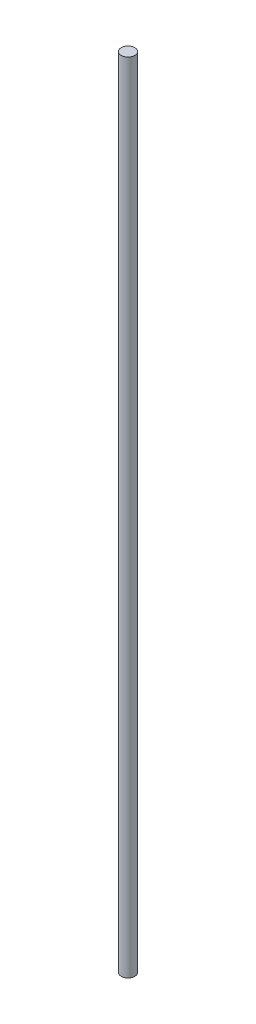
ISO-10303-21;
HEADER;
FILE_DESCRIPTION(('STEP AP214'),'2;1');
FILE_NAME('part.step','',(''),(''),'','','');
FILE_SCHEMA(('AUTOMOTIVE_DESIGN { 1 0 10303 214 1 1 1 1 }'));
ENDSEC;
DATA;
#1=APPLICATION_CONTEXT('core data for automotive mechanical design processes');
#2=APPLICATION_PROTOCOL_DEFINITION('international standard','automotive_design',2000,#1);
#3=PRODUCT_CONTEXT('',#1,'mechanical');
#4=PRODUCT('Part','Part','',(#3));
#5=PRODUCT_RELATED_PRODUCT_CATEGORY('part','',(#4));
#6=PRODUCT_DEFINITION_FORMATION('','',#4);
#7=PRODUCT_DEFINITION_CONTEXT('part definition',#1,'design');
#8=PRODUCT_DEFINITION('design','',#6,#7);
#9=PRODUCT_DEFINITION_SHAPE('','',#8);
#10=(LENGTH_UNIT() NAMED_UNIT(*) SI_UNIT(.MILLI.,.METRE.));
#11=(NAMED_UNIT(*) PLANE_ANGLE_UNIT() SI_UNIT($,.RADIAN.));
#12=(NAMED_UNIT(*) SI_UNIT($,.STERADIAN.) SOLID_ANGLE_UNIT());
#13=UNCERTAINTY_MEASURE_WITH_UNIT(LENGTH_MEASURE(1.E-05),#10,'distance_accuracy_value','');
#14=(GEOMETRIC_REPRESENTATION_CONTEXT(3) GLOBAL_UNCERTAINTY_ASSIGNED_CONTEXT((#13)) GLOBAL_UNIT_ASSIGNED_CONTEXT((#10,
#11,#12)) REPRESENTATION_CONTEXT('',''));
#15=CARTESIAN_POINT('',(0.,0.,0.));
#16=DIRECTION('',(0.,0.,1.));
#17=DIRECTION('',(1.,0.,0.));
#18=AXIS2_PLACEMENT_3D('',#15,#16,#17);
#19=CARTESIAN_POINT('',(-2.49999999999999,147.,0.));
#20=DIRECTION('',(0.,1.,0.));
#21=DIRECTION('',(0.,0.,1.));
#22=AXIS2_PLACEMENT_3D('',#19,#20,#21);
#23=CYLINDRICAL_SURFACE('',#22,2.5);
#24=CARTESIAN_POINT('',(-2.49999999999999,147.,0.));
#25=DIRECTION('',(0.,1.,0.));
#26=DIRECTION('',(0.,0.,1.));
#27=AXIS2_PLACEMENT_3D('',#24,#25,#26);
#28=CIRCLE('',#27,2.5);
#29=CARTESIAN_POINT('',(-2.49999999999999,147.,2.5));
#30=VERTEX_POINT('',#29);
#31=EDGE_CURVE('E10',#30,#30,#28,.T.);
#32=ORIENTED_EDGE('',*,*,#31,.F.);
#33=EDGE_LOOP('',(#32));
#34=FACE_BOUND('',#33,.T.);
#35=CARTESIAN_POINT('',(-2.49999999999999,-147.,0.));
#36=DIRECTION('',(0.,1.,0.));
#37=DIRECTION('',(0.,0.,1.));
#38=AXIS2_PLACEMENT_3D('',#35,#36,#37);
#39=CIRCLE('',#38,2.5);
#40=CARTESIAN_POINT('',(-2.49999999999999,-147.,2.5));
#41=VERTEX_POINT('',#40);
#42=EDGE_CURVE('E43',#41,#41,#39,.T.);
#43=ORIENTED_EDGE('',*,*,#42,.T.);
#44=EDGE_LOOP('',(#43));
#45=FACE_BOUND('',#44,.T.);
#46=ADVANCED_FACE('F37',(#34,#45),#23,.T.);
#47=CARTESIAN_POINT('',(-2.49999999999999,147.,0.));
#48=DIRECTION('',(0.,-1.,0.));
#49=DIRECTION('',(0.,0.,-1.));
#50=AXIS2_PLACEMENT_3D('',#47,#48,#49);
#51=PLANE('',#50);
#52=ORIENTED_EDGE('',*,*,#31,.T.);
#53=EDGE_LOOP('',(#52));
#54=FACE_BOUND('',#53,.T.);
#55=ADVANCED_FACE('F52',(#54),#51,.F.);
#56=CARTESIAN_POINT('',(-2.49999999999999,-147.,0.));
#57=DIRECTION('',(0.,1.,0.));
#58=DIRECTION('',(0.,0.,1.));
#59=AXIS2_PLACEMENT_3D('',#56,#57,#58);
#60=PLANE('',#59);
#61=ORIENTED_EDGE('',*,*,#42,.F.);
#62=EDGE_LOOP('',(#61));
#63=FACE_BOUND('',#62,.T.);
#64=ADVANCED_FACE('F50',(#63),#60,.F.);
#65=CLOSED_SHELL('',(#46,#55,#64));
#66=MANIFOLD_SOLID_BREP('B2',#65);
#67=ADVANCED_BREP_SHAPE_REPRESENTATION('',(#18,#66),#14);
#68=SHAPE_DEFINITION_REPRESENTATION(#9,#67);
ENDSEC;
END-ISO-10303-21;
